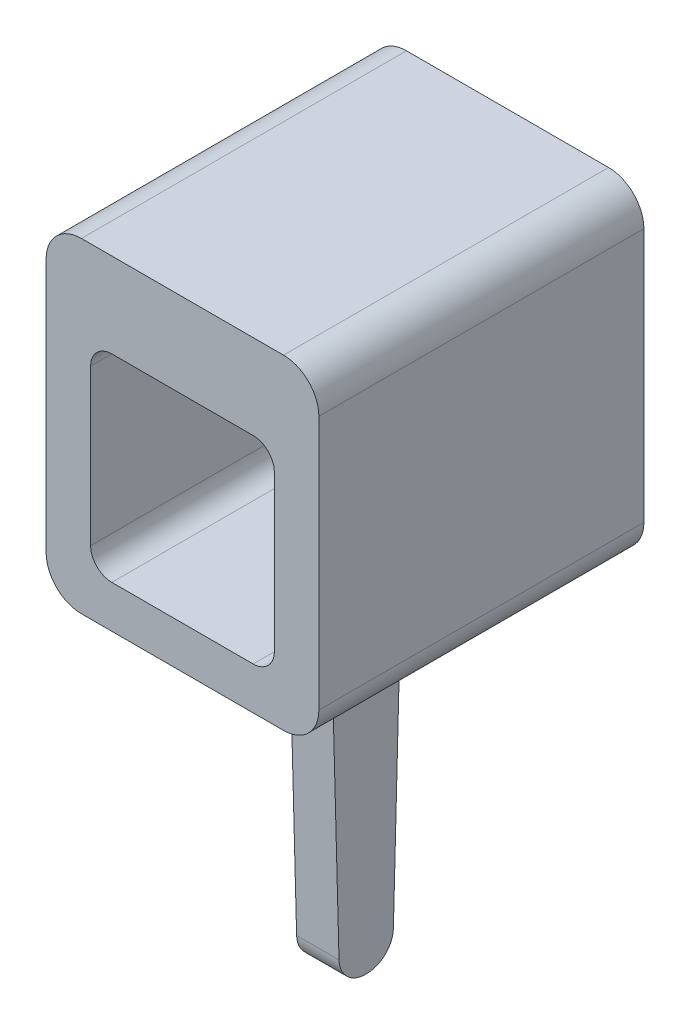
ISO-10303-21;
HEADER;
FILE_DESCRIPTION(('STEP AP214'),'2;1');
FILE_NAME('part.step','',(''),(''),'','','');
FILE_SCHEMA(('AUTOMOTIVE_DESIGN { 1 0 10303 214 1 1 1 1 }'));
ENDSEC;
DATA;
#1=APPLICATION_CONTEXT('core data for automotive mechanical design processes');
#2=APPLICATION_PROTOCOL_DEFINITION('international standard','automotive_design',2000,#1);
#3=PRODUCT_CONTEXT('',#1,'mechanical');
#4=PRODUCT('Part','Part','',(#3));
#5=PRODUCT_RELATED_PRODUCT_CATEGORY('part','',(#4));
#6=PRODUCT_DEFINITION_FORMATION('','',#4);
#7=PRODUCT_DEFINITION_CONTEXT('part definition',#1,'design');
#8=PRODUCT_DEFINITION('design','',#6,#7);
#9=PRODUCT_DEFINITION_SHAPE('','',#8);
#10=(LENGTH_UNIT() NAMED_UNIT(*) SI_UNIT(.MILLI.,.METRE.));
#11=(NAMED_UNIT(*) PLANE_ANGLE_UNIT() SI_UNIT($,.RADIAN.));
#12=(NAMED_UNIT(*) SI_UNIT($,.STERADIAN.) SOLID_ANGLE_UNIT());
#13=UNCERTAINTY_MEASURE_WITH_UNIT(LENGTH_MEASURE(1.E-05),#10,'distance_accuracy_value','');
#14=(GEOMETRIC_REPRESENTATION_CONTEXT(3) GLOBAL_UNCERTAINTY_ASSIGNED_CONTEXT((#13)) GLOBAL_UNIT_ASSIGNED_CONTEXT((#10,
#11,#12)) REPRESENTATION_CONTEXT('',''));
#15=CARTESIAN_POINT('',(0.,0.,0.));
#16=DIRECTION('',(0.,0.,1.));
#17=DIRECTION('',(1.,0.,0.));
#18=AXIS2_PLACEMENT_3D('',#15,#16,#17);
#19=CARTESIAN_POINT('',(0.,0.,0.));
#20=DIRECTION('',(0.,1.,0.));
#21=DIRECTION('',(0.,0.,1.));
#22=AXIS2_PLACEMENT_3D('',#19,#20,#21);
#23=PLANE('',#22);
#24=DIRECTION('',(-1.,0.,0.));
#25=VECTOR('',#24,1.);
#26=CARTESIAN_POINT('',(-1.93,0.,-2.3));
#27=LINE('',#26,#25);
#28=CARTESIAN_POINT('',(1.43,0.,-2.3));
#29=VERTEX_POINT('',#28);
#30=CARTESIAN_POINT('',(-1.43,0.,-2.3));
#31=VERTEX_POINT('',#30);
#32=EDGE_CURVE('E241',#29,#31,#27,.T.);
#33=ORIENTED_EDGE('',*,*,#32,.F.);
#34=DIRECTION('',(0.,0.,-1.));
#35=VECTOR('',#34,1.);
#36=CARTESIAN_POINT('',(1.43,0.,0.));
#37=LINE('',#36,#35);
#38=CARTESIAN_POINT('',(1.43,0.,2.3));
#39=VERTEX_POINT('',#38);
#40=EDGE_CURVE('E275',#29,#39,#37,.F.);
#41=ORIENTED_EDGE('',*,*,#40,.T.);
#42=DIRECTION('',(1.,0.,0.));
#43=VECTOR('',#42,1.);
#44=CARTESIAN_POINT('',(-1.93,0.,2.3));
#45=LINE('',#44,#43);
#46=CARTESIAN_POINT('',(-1.43,0.,2.3));
#47=VERTEX_POINT('',#46);
#48=EDGE_CURVE('E225',#47,#39,#45,.T.);
#49=ORIENTED_EDGE('',*,*,#48,.F.);
#50=DIRECTION('',(0.,0.,1.));
#51=VECTOR('',#50,1.);
#52=CARTESIAN_POINT('',(-1.43,0.,0.));
#53=LINE('',#52,#51);
#54=EDGE_CURVE('E273',#47,#31,#53,.F.);
#55=ORIENTED_EDGE('',*,*,#54,.T.);
#56=EDGE_LOOP('',(#33,#41,#49,#55));
#57=FACE_BOUND('',#56,.T.);
#58=DIRECTION('',(0.,0.,-1.));
#59=VECTOR('',#58,1.);
#60=CARTESIAN_POINT('',(-0.3,0.,0.5));
#61=LINE('',#60,#59);
#62=CARTESIAN_POINT('',(-0.3,0.,0.5));
#63=VERTEX_POINT('',#62);
#64=CARTESIAN_POINT('',(-0.3,0.,-0.5));
#65=VERTEX_POINT('',#64);
#66=EDGE_CURVE('E185',#63,#65,#61,.T.);
#67=ORIENTED_EDGE('',*,*,#66,.F.);
#68=DIRECTION('',(-1.,0.,0.));
#69=VECTOR('',#68,1.);
#70=CARTESIAN_POINT('',(-0.3,0.,0.5));
#71=LINE('',#70,#69);
#72=CARTESIAN_POINT('',(0.3,0.,0.5));
#73=VERTEX_POINT('',#72);
#74=EDGE_CURVE('E194',#73,#63,#71,.T.);
#75=ORIENTED_EDGE('',*,*,#74,.F.);
#76=DIRECTION('',(0.,0.,1.));
#77=VECTOR('',#76,1.);
#78=CARTESIAN_POINT('',(0.3,0.,0.5));
#79=LINE('',#78,#77);
#80=CARTESIAN_POINT('',(0.3,0.,-0.5));
#81=VERTEX_POINT('',#80);
#82=EDGE_CURVE('E204',#81,#73,#79,.T.);
#83=ORIENTED_EDGE('',*,*,#82,.F.);
#84=DIRECTION('',(1.,0.,0.));
#85=VECTOR('',#84,1.);
#86=CARTESIAN_POINT('',(-0.3,0.,-0.5));
#87=LINE('',#86,#85);
#88=EDGE_CURVE('E197',#65,#81,#87,.T.);
#89=ORIENTED_EDGE('',*,*,#88,.F.);
#90=EDGE_LOOP('',(#67,#75,#83,#89));
#91=FACE_BOUND('',#90,.T.);
#92=ADVANCED_FACE('F34',(#57,#91),#23,.F.);
#93=CARTESIAN_POINT('',(-1.93,4.6,-2.3));
#94=DIRECTION('',(1.,0.,0.));
#95=DIRECTION('',(0.,0.,-1.));
#96=AXIS2_PLACEMENT_3D('',#93,#94,#95);
#97=PLANE('',#96);
#98=DIRECTION('',(0.,-1.,0.));
#99=VECTOR('',#98,1.);
#100=CARTESIAN_POINT('',(-1.93,4.6,-2.3));
#101=LINE('',#100,#99);
#102=CARTESIAN_POINT('',(-1.93,4.1,-2.3));
#103=VERTEX_POINT('',#102);
#104=CARTESIAN_POINT('',(-1.93,0.5,-2.3));
#105=VERTEX_POINT('',#104);
#106=EDGE_CURVE('E244',#103,#105,#101,.T.);
#107=ORIENTED_EDGE('',*,*,#106,.T.);
#108=DIRECTION('',(0.,0.,1.));
#109=VECTOR('',#108,1.);
#110=CARTESIAN_POINT('',(-1.93,0.5,-2.3));
#111=LINE('',#110,#109);
#112=CARTESIAN_POINT('',(-1.93,0.5,2.3));
#113=VERTEX_POINT('',#112);
#114=EDGE_CURVE('E287',#105,#113,#111,.T.);
#115=ORIENTED_EDGE('',*,*,#114,.T.);
#116=DIRECTION('',(0.,-1.,0.));
#117=VECTOR('',#116,1.);
#118=CARTESIAN_POINT('',(-1.93,4.6,2.3));
#119=LINE('',#118,#117);
#120=CARTESIAN_POINT('',(-1.93,4.1,2.3));
#121=VERTEX_POINT('',#120);
#122=EDGE_CURVE('E257',#121,#113,#119,.T.);
#123=ORIENTED_EDGE('',*,*,#122,.F.);
#124=DIRECTION('',(0.,0.,1.));
#125=VECTOR('',#124,1.);
#126=CARTESIAN_POINT('',(-1.93,4.1,-2.3));
#127=LINE('',#126,#125);
#128=EDGE_CURVE('E285',#121,#103,#127,.F.);
#129=ORIENTED_EDGE('',*,*,#128,.T.);
#130=EDGE_LOOP('',(#107,#115,#123,#129));
#131=FACE_BOUND('',#130,.T.);
#132=ADVANCED_FACE('F366',(#131),#97,.F.);
#133=CARTESIAN_POINT('',(-1.93,4.6,2.3));
#134=DIRECTION('',(0.,0.,-1.));
#135=DIRECTION('',(-1.,0.,0.));
#136=AXIS2_PLACEMENT_3D('',#133,#134,#135);
#137=PLANE('',#136);
#138=DIRECTION('',(1.,0.,0.));
#139=VECTOR('',#138,1.);
#140=CARTESIAN_POINT('',(-1.3,0.6,2.3));
#141=LINE('',#140,#139);
#142=CARTESIAN_POINT('',(-1.,0.6,2.3));
#143=VERTEX_POINT('',#142);
#144=CARTESIAN_POINT('',(1.,0.6,2.3));
#145=VERTEX_POINT('',#144);
#146=EDGE_CURVE('E229',#143,#145,#141,.T.);
#147=ORIENTED_EDGE('',*,*,#146,.F.);
#148=CARTESIAN_POINT('',(-1.,0.9,2.3));
#149=DIRECTION('',(0.,0.,-1.));
#150=DIRECTION('',(-1.,0.,0.));
#151=AXIS2_PLACEMENT_3D('',#148,#149,#150);
#152=CIRCLE('',#151,0.3);
#153=CARTESIAN_POINT('',(-1.3,0.9,2.3));
#154=VERTEX_POINT('',#153);
#155=EDGE_CURVE('E324',#143,#154,#152,.T.);
#156=ORIENTED_EDGE('',*,*,#155,.T.);
#157=DIRECTION('',(0.,-1.,0.));
#158=VECTOR('',#157,1.);
#159=CARTESIAN_POINT('',(-1.3,3.4,2.3));
#160=LINE('',#159,#158);
#161=CARTESIAN_POINT('',(-1.3,3.1,2.3));
#162=VERTEX_POINT('',#161);
#163=EDGE_CURVE('E226',#162,#154,#160,.T.);
#164=ORIENTED_EDGE('',*,*,#163,.F.);
#165=CARTESIAN_POINT('',(-1.,3.1,2.3));
#166=DIRECTION('',(0.,0.,-1.));
#167=DIRECTION('',(-1.,0.,0.));
#168=AXIS2_PLACEMENT_3D('',#165,#166,#167);
#169=CIRCLE('',#168,0.3);
#170=CARTESIAN_POINT('',(-1.,3.4,2.3));
#171=VERTEX_POINT('',#170);
#172=EDGE_CURVE('E320',#162,#171,#169,.T.);
#173=ORIENTED_EDGE('',*,*,#172,.T.);
#174=DIRECTION('',(-1.,0.,0.));
#175=VECTOR('',#174,1.);
#176=CARTESIAN_POINT('',(-1.3,3.4,2.3));
#177=LINE('',#176,#175);
#178=CARTESIAN_POINT('',(1.,3.4,2.3));
#179=VERTEX_POINT('',#178);
#180=EDGE_CURVE('E216',#179,#171,#177,.T.);
#181=ORIENTED_EDGE('',*,*,#180,.F.);
#182=CARTESIAN_POINT('',(1.,3.1,2.3));
#183=DIRECTION('',(0.,0.,-1.));
#184=DIRECTION('',(-1.,0.,0.));
#185=AXIS2_PLACEMENT_3D('',#182,#183,#184);
#186=CIRCLE('',#185,0.3);
#187=CARTESIAN_POINT('',(1.3,3.1,2.3));
#188=VERTEX_POINT('',#187);
#189=EDGE_CURVE('E316',#179,#188,#186,.T.);
#190=ORIENTED_EDGE('',*,*,#189,.T.);
#191=DIRECTION('',(0.,1.,0.));
#192=VECTOR('',#191,1.);
#193=CARTESIAN_POINT('',(1.3,3.4,2.3));
#194=LINE('',#193,#192);
#195=CARTESIAN_POINT('',(1.3,0.9,2.3));
#196=VERTEX_POINT('',#195);
#197=EDGE_CURVE('E232',#196,#188,#194,.T.);
#198=ORIENTED_EDGE('',*,*,#197,.F.);
#199=CARTESIAN_POINT('',(1.,0.9,2.3));
#200=DIRECTION('',(0.,0.,-1.));
#201=DIRECTION('',(-1.,0.,0.));
#202=AXIS2_PLACEMENT_3D('',#199,#200,#201);
#203=CIRCLE('',#202,0.3);
#204=EDGE_CURVE('E328',#196,#145,#203,.T.);
#205=ORIENTED_EDGE('',*,*,#204,.T.);
#206=EDGE_LOOP('',(#147,#156,#164,#173,#181,#190,#198,#205));
#207=FACE_BOUND('',#206,.T.);
#208=ORIENTED_EDGE('',*,*,#48,.T.);
#209=CARTESIAN_POINT('',(1.43,0.5,2.3));
#210=DIRECTION('',(0.,0.,-1.));
#211=DIRECTION('',(-1.,0.,0.));
#212=AXIS2_PLACEMENT_3D('',#209,#210,#211);
#213=CIRCLE('',#212,0.5);
#214=CARTESIAN_POINT('',(1.93,0.5,2.3));
#215=VERTEX_POINT('',#214);
#216=EDGE_CURVE('E283',#39,#215,#213,.F.);
#217=ORIENTED_EDGE('',*,*,#216,.T.);
#218=DIRECTION('',(0.,-1.,0.));
#219=VECTOR('',#218,1.);
#220=CARTESIAN_POINT('',(1.93,4.6,2.3));
#221=LINE('',#220,#219);
#222=CARTESIAN_POINT('',(1.93,4.1,2.3));
#223=VERTEX_POINT('',#222);
#224=EDGE_CURVE('E254',#223,#215,#221,.T.);
#225=ORIENTED_EDGE('',*,*,#224,.F.);
#226=CARTESIAN_POINT('',(1.43,4.1,2.3));
#227=DIRECTION('',(0.,0.,-1.));
#228=DIRECTION('',(-1.,0.,0.));
#229=AXIS2_PLACEMENT_3D('',#226,#227,#228);
#230=CIRCLE('',#229,0.5);
#231=CARTESIAN_POINT('',(1.43,4.6,2.3));
#232=VERTEX_POINT('',#231);
#233=EDGE_CURVE('E279',#223,#232,#230,.F.);
#234=ORIENTED_EDGE('',*,*,#233,.T.);
#235=DIRECTION('',(1.,0.,0.));
#236=VECTOR('',#235,1.);
#237=CARTESIAN_POINT('',(-1.93,4.6,2.3));
#238=LINE('',#237,#236);
#239=CARTESIAN_POINT('',(-1.43,4.6,2.3));
#240=VERTEX_POINT('',#239);
#241=EDGE_CURVE('E237',#240,#232,#238,.T.);
#242=ORIENTED_EDGE('',*,*,#241,.F.);
#243=CARTESIAN_POINT('',(-1.43,4.1,2.3));
#244=DIRECTION('',(0.,0.,-1.));
#245=DIRECTION('',(-1.,0.,0.));
#246=AXIS2_PLACEMENT_3D('',#243,#244,#245);
#247=CIRCLE('',#246,0.5);
#248=EDGE_CURVE('E277',#240,#121,#247,.F.);
#249=ORIENTED_EDGE('',*,*,#248,.T.);
#250=ORIENTED_EDGE('',*,*,#122,.T.);
#251=CARTESIAN_POINT('',(-1.43,0.5,2.3));
#252=DIRECTION('',(0.,0.,-1.));
#253=DIRECTION('',(-1.,0.,0.));
#254=AXIS2_PLACEMENT_3D('',#251,#252,#253);
#255=CIRCLE('',#254,0.5);
#256=EDGE_CURVE('E281',#113,#47,#255,.F.);
#257=ORIENTED_EDGE('',*,*,#256,.T.);
#258=EDGE_LOOP('',(#208,#217,#225,#234,#242,#249,#250,#257));
#259=FACE_BOUND('',#258,.T.);
#260=ADVANCED_FACE('F372',(#207,#259),#137,.F.);
#261=CARTESIAN_POINT('',(1.93,4.6,-2.3));
#262=DIRECTION('',(-1.,0.,0.));
#263=DIRECTION('',(0.,0.,1.));
#264=AXIS2_PLACEMENT_3D('',#261,#262,#263);
#265=PLANE('',#264);
#266=ORIENTED_EDGE('',*,*,#224,.T.);
#267=DIRECTION('',(0.,0.,-1.));
#268=VECTOR('',#267,1.);
#269=CARTESIAN_POINT('',(1.93,0.5,-2.3));
#270=LINE('',#269,#268);
#271=CARTESIAN_POINT('',(1.93,0.5,-2.3));
#272=VERTEX_POINT('',#271);
#273=EDGE_CURVE('E262',#215,#272,#270,.T.);
#274=ORIENTED_EDGE('',*,*,#273,.T.);
#275=DIRECTION('',(0.,-1.,0.));
#276=VECTOR('',#275,1.);
#277=CARTESIAN_POINT('',(1.93,4.6,-2.3));
#278=LINE('',#277,#276);
#279=CARTESIAN_POINT('',(1.93,4.1,-2.3));
#280=VERTEX_POINT('',#279);
#281=EDGE_CURVE('E251',#280,#272,#278,.T.);
#282=ORIENTED_EDGE('',*,*,#281,.F.);
#283=DIRECTION('',(0.,0.,-1.));
#284=VECTOR('',#283,1.);
#285=CARTESIAN_POINT('',(1.93,4.1,2.3));
#286=LINE('',#285,#284);
#287=EDGE_CURVE('E260',#280,#223,#286,.F.);
#288=ORIENTED_EDGE('',*,*,#287,.T.);
#289=EDGE_LOOP('',(#266,#274,#282,#288));
#290=FACE_BOUND('',#289,.T.);
#291=ADVANCED_FACE('F383',(#290),#265,.F.);
#292=CARTESIAN_POINT('',(-1.93,4.6,-2.3));
#293=DIRECTION('',(0.,0.,1.));
#294=DIRECTION('',(1.,0.,0.));
#295=AXIS2_PLACEMENT_3D('',#292,#293,#294);
#296=PLANE('',#295);
#297=DIRECTION('',(0.,1.,0.));
#298=VECTOR('',#297,1.);
#299=CARTESIAN_POINT('',(1.3,3.4,-2.3));
#300=LINE('',#299,#298);
#301=CARTESIAN_POINT('',(1.3,0.9,-2.3));
#302=VERTEX_POINT('',#301);
#303=CARTESIAN_POINT('',(1.3,3.1,-2.3));
#304=VERTEX_POINT('',#303);
#305=EDGE_CURVE('E219',#302,#304,#300,.T.);
#306=ORIENTED_EDGE('',*,*,#305,.T.);
#307=CARTESIAN_POINT('',(1.,3.1,-2.3));
#308=DIRECTION('',(0.,0.,1.));
#309=DIRECTION('',(1.,0.,0.));
#310=AXIS2_PLACEMENT_3D('',#307,#308,#309);
#311=CIRCLE('',#310,0.3);
#312=CARTESIAN_POINT('',(1.,3.4,-2.3));
#313=VERTEX_POINT('',#312);
#314=EDGE_CURVE('E318',#304,#313,#311,.T.);
#315=ORIENTED_EDGE('',*,*,#314,.T.);
#316=DIRECTION('',(-1.,0.,0.));
#317=VECTOR('',#316,1.);
#318=CARTESIAN_POINT('',(-1.3,3.4,-2.3));
#319=LINE('',#318,#317);
#320=CARTESIAN_POINT('',(-1.,3.4,-2.3));
#321=VERTEX_POINT('',#320);
#322=EDGE_CURVE('E222',#313,#321,#319,.T.);
#323=ORIENTED_EDGE('',*,*,#322,.T.);
#324=CARTESIAN_POINT('',(-1.,3.1,-2.3));
#325=DIRECTION('',(0.,0.,1.));
#326=DIRECTION('',(1.,0.,0.));
#327=AXIS2_PLACEMENT_3D('',#324,#325,#326);
#328=CIRCLE('',#327,0.3);
#329=CARTESIAN_POINT('',(-1.3,3.1,-2.3));
#330=VERTEX_POINT('',#329);
#331=EDGE_CURVE('E322',#321,#330,#328,.T.);
#332=ORIENTED_EDGE('',*,*,#331,.T.);
#333=DIRECTION('',(0.,-1.,0.));
#334=VECTOR('',#333,1.);
#335=CARTESIAN_POINT('',(-1.3,3.4,-2.3));
#336=LINE('',#335,#334);
#337=CARTESIAN_POINT('',(-1.3,0.9,-2.3));
#338=VERTEX_POINT('',#337);
#339=EDGE_CURVE('E212',#330,#338,#336,.T.);
#340=ORIENTED_EDGE('',*,*,#339,.T.);
#341=CARTESIAN_POINT('',(-1.,0.9,-2.3));
#342=DIRECTION('',(0.,0.,1.));
#343=DIRECTION('',(1.,0.,0.));
#344=AXIS2_PLACEMENT_3D('',#341,#342,#343);
#345=CIRCLE('',#344,0.3);
#346=CARTESIAN_POINT('',(-1.,0.6,-2.3));
#347=VERTEX_POINT('',#346);
#348=EDGE_CURVE('E326',#338,#347,#345,.T.);
#349=ORIENTED_EDGE('',*,*,#348,.T.);
#350=DIRECTION('',(1.,0.,0.));
#351=VECTOR('',#350,1.);
#352=CARTESIAN_POINT('',(-1.3,0.6,-2.3));
#353=LINE('',#352,#351);
#354=CARTESIAN_POINT('',(1.,0.6,-2.3));
#355=VERTEX_POINT('',#354);
#356=EDGE_CURVE('E215',#347,#355,#353,.T.);
#357=ORIENTED_EDGE('',*,*,#356,.T.);
#358=CARTESIAN_POINT('',(1.,0.9,-2.3));
#359=DIRECTION('',(0.,0.,1.));
#360=DIRECTION('',(1.,0.,0.));
#361=AXIS2_PLACEMENT_3D('',#358,#359,#360);
#362=CIRCLE('',#361,0.3);
#363=EDGE_CURVE('E330',#355,#302,#362,.T.);
#364=ORIENTED_EDGE('',*,*,#363,.T.);
#365=EDGE_LOOP('',(#306,#315,#323,#332,#340,#349,#357,#364));
#366=FACE_BOUND('',#365,.T.);
#367=ORIENTED_EDGE('',*,*,#281,.T.);
#368=CARTESIAN_POINT('',(1.43,0.5,-2.3));
#369=DIRECTION('',(0.,0.,1.));
#370=DIRECTION('',(1.,0.,0.));
#371=AXIS2_PLACEMENT_3D('',#368,#369,#370);
#372=CIRCLE('',#371,0.5);
#373=EDGE_CURVE('E271',#272,#29,#372,.F.);
#374=ORIENTED_EDGE('',*,*,#373,.T.);
#375=ORIENTED_EDGE('',*,*,#32,.T.);
#376=CARTESIAN_POINT('',(-1.43,0.5,-2.3));
#377=DIRECTION('',(0.,0.,1.));
#378=DIRECTION('',(1.,0.,0.));
#379=AXIS2_PLACEMENT_3D('',#376,#377,#378);
#380=CIRCLE('',#379,0.5);
#381=EDGE_CURVE('E269',#31,#105,#380,.F.);
#382=ORIENTED_EDGE('',*,*,#381,.T.);
#383=ORIENTED_EDGE('',*,*,#106,.F.);
#384=CARTESIAN_POINT('',(-1.43,4.1,-2.3));
#385=DIRECTION('',(0.,0.,1.));
#386=DIRECTION('',(1.,0.,0.));
#387=AXIS2_PLACEMENT_3D('',#384,#385,#386);
#388=CIRCLE('',#387,0.5);
#389=CARTESIAN_POINT('',(-1.43,4.6,-2.3));
#390=VERTEX_POINT('',#389);
#391=EDGE_CURVE('E265',#103,#390,#388,.F.);
#392=ORIENTED_EDGE('',*,*,#391,.T.);
#393=DIRECTION('',(-1.,0.,0.));
#394=VECTOR('',#393,1.);
#395=CARTESIAN_POINT('',(-1.93,4.6,-2.3));
#396=LINE('',#395,#394);
#397=CARTESIAN_POINT('',(1.43,4.6,-2.3));
#398=VERTEX_POINT('',#397);
#399=EDGE_CURVE('E240',#398,#390,#396,.T.);
#400=ORIENTED_EDGE('',*,*,#399,.F.);
#401=CARTESIAN_POINT('',(1.43,4.1,-2.3));
#402=DIRECTION('',(0.,0.,1.));
#403=DIRECTION('',(1.,0.,0.));
#404=AXIS2_PLACEMENT_3D('',#401,#402,#403);
#405=CIRCLE('',#404,0.5);
#406=EDGE_CURVE('E267',#398,#280,#405,.F.);
#407=ORIENTED_EDGE('',*,*,#406,.T.);
#408=EDGE_LOOP('',(#367,#374,#375,#382,#383,#392,#400,#407));
#409=FACE_BOUND('',#408,.T.);
#410=ADVANCED_FACE('F380',(#366,#409),#296,.F.);
#411=CARTESIAN_POINT('',(0.,4.6,0.));
#412=DIRECTION('',(0.,1.,0.));
#413=DIRECTION('',(0.,0.,1.));
#414=AXIS2_PLACEMENT_3D('',#411,#412,#413);
#415=PLANE('',#414);
#416=ORIENTED_EDGE('',*,*,#241,.T.);
#417=DIRECTION('',(0.,0.,-1.));
#418=VECTOR('',#417,1.);
#419=CARTESIAN_POINT('',(1.43,4.6,-2.3));
#420=LINE('',#419,#418);
#421=EDGE_CURVE('E293',#232,#398,#420,.T.);
#422=ORIENTED_EDGE('',*,*,#421,.T.);
#423=ORIENTED_EDGE('',*,*,#399,.T.);
#424=DIRECTION('',(0.,0.,1.));
#425=VECTOR('',#424,1.);
#426=CARTESIAN_POINT('',(-1.43,4.6,2.3));
#427=LINE('',#426,#425);
#428=EDGE_CURVE('E290',#390,#240,#427,.T.);
#429=ORIENTED_EDGE('',*,*,#428,.T.);
#430=EDGE_LOOP('',(#416,#422,#423,#429));
#431=FACE_BOUND('',#430,.T.);
#432=ADVANCED_FACE('F378',(#431),#415,.T.);
#433=CARTESIAN_POINT('',(-1.3,3.4,-2.3));
#434=DIRECTION('',(-1.,0.,0.));
#435=DIRECTION('',(0.,-1.,0.));
#436=AXIS2_PLACEMENT_3D('',#433,#434,#435);
#437=PLANE('',#436);
#438=ORIENTED_EDGE('',*,*,#339,.F.);
#439=DIRECTION('',(0.,0.,1.));
#440=VECTOR('',#439,1.);
#441=CARTESIAN_POINT('',(-1.3,3.1,2.3));
#442=LINE('',#441,#440);
#443=EDGE_CURVE('E308',#330,#162,#442,.T.);
#444=ORIENTED_EDGE('',*,*,#443,.T.);
#445=ORIENTED_EDGE('',*,*,#163,.T.);
#446=DIRECTION('',(0.,0.,1.));
#447=VECTOR('',#446,1.);
#448=CARTESIAN_POINT('',(-1.3,0.9,-2.3));
#449=LINE('',#448,#447);
#450=EDGE_CURVE('E306',#154,#338,#449,.F.);
#451=ORIENTED_EDGE('',*,*,#450,.T.);
#452=EDGE_LOOP('',(#438,#444,#445,#451));
#453=FACE_BOUND('',#452,.T.);
#454=ADVANCED_FACE('F540',(#453),#437,.F.);
#455=CARTESIAN_POINT('',(-1.3,3.4,-2.3));
#456=DIRECTION('',(0.,1.,0.));
#457=DIRECTION('',(-1.,0.,0.));
#458=AXIS2_PLACEMENT_3D('',#455,#456,#457);
#459=PLANE('',#458);
#460=ORIENTED_EDGE('',*,*,#322,.F.);
#461=DIRECTION('',(0.,0.,1.));
#462=VECTOR('',#461,1.);
#463=CARTESIAN_POINT('',(1.,3.4,2.3));
#464=LINE('',#463,#462);
#465=EDGE_CURVE('E298',#313,#179,#464,.T.);
#466=ORIENTED_EDGE('',*,*,#465,.T.);
#467=ORIENTED_EDGE('',*,*,#180,.T.);
#468=DIRECTION('',(0.,0.,1.));
#469=VECTOR('',#468,1.);
#470=CARTESIAN_POINT('',(-1.,3.4,-2.3));
#471=LINE('',#470,#469);
#472=EDGE_CURVE('E296',#171,#321,#471,.F.);
#473=ORIENTED_EDGE('',*,*,#472,.T.);
#474=EDGE_LOOP('',(#460,#466,#467,#473));
#475=FACE_BOUND('',#474,.T.);
#476=ADVANCED_FACE('F531',(#475),#459,.F.);
#477=CARTESIAN_POINT('',(1.3,3.4,-2.3));
#478=DIRECTION('',(1.,0.,0.));
#479=DIRECTION('',(0.,1.,0.));
#480=AXIS2_PLACEMENT_3D('',#477,#478,#479);
#481=PLANE('',#480);
#482=ORIENTED_EDGE('',*,*,#197,.T.);
#483=DIRECTION('',(0.,0.,1.));
#484=VECTOR('',#483,1.);
#485=CARTESIAN_POINT('',(1.3,3.1,-2.3));
#486=LINE('',#485,#484);
#487=EDGE_CURVE('E304',#188,#304,#486,.F.);
#488=ORIENTED_EDGE('',*,*,#487,.T.);
#489=ORIENTED_EDGE('',*,*,#305,.F.);
#490=DIRECTION('',(0.,0.,1.));
#491=VECTOR('',#490,1.);
#492=CARTESIAN_POINT('',(1.3,0.9,2.3));
#493=LINE('',#492,#491);
#494=EDGE_CURVE('E301',#302,#196,#493,.T.);
#495=ORIENTED_EDGE('',*,*,#494,.T.);
#496=EDGE_LOOP('',(#482,#488,#489,#495));
#497=FACE_BOUND('',#496,.T.);
#498=ADVANCED_FACE('F522',(#497),#481,.F.);
#499=CARTESIAN_POINT('',(-1.3,0.6,-2.3));
#500=DIRECTION('',(0.,-1.,0.));
#501=DIRECTION('',(0.,0.,-1.));
#502=AXIS2_PLACEMENT_3D('',#499,#500,#501);
#503=PLANE('',#502);
#504=ORIENTED_EDGE('',*,*,#356,.F.);
#505=DIRECTION('',(0.,0.,1.));
#506=VECTOR('',#505,1.);
#507=CARTESIAN_POINT('',(-1.,0.6,2.3));
#508=LINE('',#507,#506);
#509=EDGE_CURVE('E313',#347,#143,#508,.T.);
#510=ORIENTED_EDGE('',*,*,#509,.T.);
#511=ORIENTED_EDGE('',*,*,#146,.T.);
#512=DIRECTION('',(0.,0.,1.));
#513=VECTOR('',#512,1.);
#514=CARTESIAN_POINT('',(1.,0.6,-2.3));
#515=LINE('',#514,#513);
#516=EDGE_CURVE('E311',#145,#355,#515,.F.);
#517=ORIENTED_EDGE('',*,*,#516,.T.);
#518=EDGE_LOOP('',(#504,#510,#511,#517));
#519=FACE_BOUND('',#518,.T.);
#520=ADVANCED_FACE('F395',(#519),#503,.F.);
#521=CARTESIAN_POINT('',(1.43,0.5,-2.3));
#522=DIRECTION('',(0.,0.,-1.));
#523=DIRECTION('',(-1.,0.,0.));
#524=AXIS2_PLACEMENT_3D('',#521,#522,#523);
#525=CYLINDRICAL_SURFACE('',#524,0.5);
#526=ORIENTED_EDGE('',*,*,#216,.F.);
#527=ORIENTED_EDGE('',*,*,#40,.F.);
#528=ORIENTED_EDGE('',*,*,#373,.F.);
#529=ORIENTED_EDGE('',*,*,#273,.F.);
#530=EDGE_LOOP('',(#526,#527,#528,#529));
#531=FACE_BOUND('',#530,.T.);
#532=ADVANCED_FACE('F391',(#531),#525,.T.);
#533=CARTESIAN_POINT('',(-1.43,0.5,-2.3));
#534=DIRECTION('',(0.,0.,1.));
#535=DIRECTION('',(1.,0.,0.));
#536=AXIS2_PLACEMENT_3D('',#533,#534,#535);
#537=CYLINDRICAL_SURFACE('',#536,0.5);
#538=ORIENTED_EDGE('',*,*,#381,.F.);
#539=ORIENTED_EDGE('',*,*,#54,.F.);
#540=ORIENTED_EDGE('',*,*,#256,.F.);
#541=ORIENTED_EDGE('',*,*,#114,.F.);
#542=EDGE_LOOP('',(#538,#539,#540,#541));
#543=FACE_BOUND('',#542,.T.);
#544=ADVANCED_FACE('F394',(#543),#537,.T.);
#545=CARTESIAN_POINT('',(1.43,4.1,0.));
#546=DIRECTION('',(0.,0.,1.));
#547=DIRECTION('',(1.,0.,0.));
#548=AXIS2_PLACEMENT_3D('',#545,#546,#547);
#549=CYLINDRICAL_SURFACE('',#548,0.5);
#550=ORIENTED_EDGE('',*,*,#233,.F.);
#551=ORIENTED_EDGE('',*,*,#287,.F.);
#552=ORIENTED_EDGE('',*,*,#406,.F.);
#553=ORIENTED_EDGE('',*,*,#421,.F.);
#554=EDGE_LOOP('',(#550,#551,#552,#553));
#555=FACE_BOUND('',#554,.T.);
#556=ADVANCED_FACE('F399',(#555),#549,.T.);
#557=CARTESIAN_POINT('',(-1.43,4.1,0.));
#558=DIRECTION('',(0.,0.,-1.));
#559=DIRECTION('',(-1.,0.,0.));
#560=AXIS2_PLACEMENT_3D('',#557,#558,#559);
#561=CYLINDRICAL_SURFACE('',#560,0.5);
#562=ORIENTED_EDGE('',*,*,#391,.F.);
#563=ORIENTED_EDGE('',*,*,#128,.F.);
#564=ORIENTED_EDGE('',*,*,#248,.F.);
#565=ORIENTED_EDGE('',*,*,#428,.F.);
#566=EDGE_LOOP('',(#562,#563,#564,#565));
#567=FACE_BOUND('',#566,.T.);
#568=ADVANCED_FACE('F403',(#567),#561,.T.);
#569=CARTESIAN_POINT('',(1.,3.1,-2.3));
#570=DIRECTION('',(0.,0.,-1.));
#571=DIRECTION('',(-1.,0.,0.));
#572=AXIS2_PLACEMENT_3D('',#569,#570,#571);
#573=CYLINDRICAL_SURFACE('',#572,0.3);
#574=ORIENTED_EDGE('',*,*,#314,.F.);
#575=ORIENTED_EDGE('',*,*,#487,.F.);
#576=ORIENTED_EDGE('',*,*,#189,.F.);
#577=ORIENTED_EDGE('',*,*,#465,.F.);
#578=EDGE_LOOP('',(#574,#575,#576,#577));
#579=FACE_BOUND('',#578,.T.);
#580=ADVANCED_FACE('F407',(#579),#573,.F.);
#581=CARTESIAN_POINT('',(-1.,3.1,-2.3));
#582=DIRECTION('',(0.,0.,-1.));
#583=DIRECTION('',(-1.,0.,0.));
#584=AXIS2_PLACEMENT_3D('',#581,#582,#583);
#585=CYLINDRICAL_SURFACE('',#584,0.3);
#586=ORIENTED_EDGE('',*,*,#331,.F.);
#587=ORIENTED_EDGE('',*,*,#472,.F.);
#588=ORIENTED_EDGE('',*,*,#172,.F.);
#589=ORIENTED_EDGE('',*,*,#443,.F.);
#590=EDGE_LOOP('',(#586,#587,#588,#589));
#591=FACE_BOUND('',#590,.T.);
#592=ADVANCED_FACE('F411',(#591),#585,.F.);
#593=CARTESIAN_POINT('',(-1.,0.9,-2.3));
#594=DIRECTION('',(0.,0.,-1.));
#595=DIRECTION('',(-1.,0.,0.));
#596=AXIS2_PLACEMENT_3D('',#593,#594,#595);
#597=CYLINDRICAL_SURFACE('',#596,0.3);
#598=ORIENTED_EDGE('',*,*,#348,.F.);
#599=ORIENTED_EDGE('',*,*,#450,.F.);
#600=ORIENTED_EDGE('',*,*,#155,.F.);
#601=ORIENTED_EDGE('',*,*,#509,.F.);
#602=EDGE_LOOP('',(#598,#599,#600,#601));
#603=FACE_BOUND('',#602,.T.);
#604=ADVANCED_FACE('F415',(#603),#597,.F.);
#605=CARTESIAN_POINT('',(1.,0.9,-2.3));
#606=DIRECTION('',(0.,0.,-1.));
#607=DIRECTION('',(-1.,0.,0.));
#608=AXIS2_PLACEMENT_3D('',#605,#606,#607);
#609=CYLINDRICAL_SURFACE('',#608,0.3);
#610=ORIENTED_EDGE('',*,*,#363,.F.);
#611=ORIENTED_EDGE('',*,*,#516,.F.);
#612=ORIENTED_EDGE('',*,*,#204,.F.);
#613=ORIENTED_EDGE('',*,*,#494,.F.);
#614=EDGE_LOOP('',(#610,#611,#612,#613));
#615=FACE_BOUND('',#614,.T.);
#616=ADVANCED_FACE('F419',(#615),#609,.F.);
#617=CARTESIAN_POINT('',(-0.3,-4.7,0.5));
#618=DIRECTION('',(1.,0.,0.));
#619=DIRECTION('',(0.,0.,-1.));
#620=AXIS2_PLACEMENT_3D('',#617,#618,#619);
#621=PLANE('',#620);
#622=DIRECTION('',(0.,-0.999646520692239,0.0265863436354284));
#623=VECTOR('',#622,1.);
#624=CARTESIAN_POINT('',(-0.3,-4.7,-0.375));
#625=LINE('',#624,#623);
#626=CARTESIAN_POINT('',(-0.3,-4.33496987886329,-0.384708247902571));
#627=VERTEX_POINT('',#626);
#628=EDGE_CURVE('E190',#65,#627,#625,.T.);
#629=ORIENTED_EDGE('',*,*,#628,.T.);
#630=CARTESIAN_POINT('',(-0.3,-4.325,-0.00984080264298135));
#631=DIRECTION('',(1.,0.,0.));
#632=DIRECTION('',(0.,0.,-1.));
#633=AXIS2_PLACEMENT_3D('',#630,#631,#632);
#634=CIRCLE('',#633,0.375);
#635=CARTESIAN_POINT('',(-0.3,-4.7,-0.00984080264298138));
#636=VERTEX_POINT('',#635);
#637=EDGE_CURVE('E42',#627,#636,#634,.F.);
#638=ORIENTED_EDGE('',*,*,#637,.T.);
#639=DIRECTION('',(0.,0.,-1.));
#640=VECTOR('',#639,1.);
#641=CARTESIAN_POINT('',(-0.3,-4.7,0.5));
#642=LINE('',#641,#640);
#643=CARTESIAN_POINT('',(-0.3,-4.7,0.00984080264298138));
#644=VERTEX_POINT('',#643);
#645=EDGE_CURVE('E203',#644,#636,#642,.T.);
#646=ORIENTED_EDGE('',*,*,#645,.F.);
#647=CARTESIAN_POINT('',(-0.3,-4.325,0.00984080264298135));
#648=DIRECTION('',(1.,0.,0.));
#649=DIRECTION('',(0.,0.,-1.));
#650=AXIS2_PLACEMENT_3D('',#647,#648,#649);
#651=CIRCLE('',#650,0.375);
#652=CARTESIAN_POINT('',(-0.3,-4.33496987886329,0.384708247902571));
#653=VERTEX_POINT('',#652);
#654=EDGE_CURVE('E49',#644,#653,#651,.F.);
#655=ORIENTED_EDGE('',*,*,#654,.T.);
#656=DIRECTION('',(0.,0.999646520692239,0.0265863436354284));
#657=VECTOR('',#656,1.);
#658=CARTESIAN_POINT('',(-0.3,-4.7,0.375));
#659=LINE('',#658,#657);
#660=EDGE_CURVE('E182',#653,#63,#659,.T.);
#661=ORIENTED_EDGE('',*,*,#660,.T.);
#662=ORIENTED_EDGE('',*,*,#66,.T.);
#663=EDGE_LOOP('',(#629,#638,#646,#655,#661,#662));
#664=FACE_BOUND('',#663,.T.);
#665=ADVANCED_FACE('F184',(#664),#621,.F.);
#666=CARTESIAN_POINT('',(0.3,-4.7,0.5));
#667=DIRECTION('',(-1.,0.,0.));
#668=DIRECTION('',(0.,0.,1.));
#669=AXIS2_PLACEMENT_3D('',#666,#667,#668);
#670=PLANE('',#669);
#671=DIRECTION('',(0.,0.,1.));
#672=VECTOR('',#671,1.);
#673=CARTESIAN_POINT('',(0.3,-4.7,0.5));
#674=LINE('',#673,#672);
#675=CARTESIAN_POINT('',(0.3,-4.7,-0.00984080264298138));
#676=VERTEX_POINT('',#675);
#677=CARTESIAN_POINT('',(0.3,-4.7,0.00984080264298138));
#678=VERTEX_POINT('',#677);
#679=EDGE_CURVE('E207',#676,#678,#674,.T.);
#680=ORIENTED_EDGE('',*,*,#679,.F.);
#681=CARTESIAN_POINT('',(0.3,-4.325,-0.00984080264298135));
#682=DIRECTION('',(-1.,0.,0.));
#683=DIRECTION('',(0.,0.,1.));
#684=AXIS2_PLACEMENT_3D('',#681,#682,#683);
#685=CIRCLE('',#684,0.375);
#686=CARTESIAN_POINT('',(0.3,-4.33496987886329,-0.384708247902571));
#687=VERTEX_POINT('',#686);
#688=EDGE_CURVE('E343',#676,#687,#685,.F.);
#689=ORIENTED_EDGE('',*,*,#688,.T.);
#690=DIRECTION('',(0.,0.999646520692239,-0.0265863436354284));
#691=VECTOR('',#690,1.);
#692=CARTESIAN_POINT('',(0.3,-4.7,-0.375));
#693=LINE('',#692,#691);
#694=EDGE_CURVE('E189',#687,#81,#693,.T.);
#695=ORIENTED_EDGE('',*,*,#694,.T.);
#696=ORIENTED_EDGE('',*,*,#82,.T.);
#697=DIRECTION('',(0.,-0.999646520692239,-0.0265863436354284));
#698=VECTOR('',#697,1.);
#699=CARTESIAN_POINT('',(0.3,-4.7,0.375));
#700=LINE('',#699,#698);
#701=CARTESIAN_POINT('',(0.3,-4.33496987886329,0.384708247902571));
#702=VERTEX_POINT('',#701);
#703=EDGE_CURVE('E202',#73,#702,#700,.T.);
#704=ORIENTED_EDGE('',*,*,#703,.T.);
#705=CARTESIAN_POINT('',(0.3,-4.325,0.00984080264298135));
#706=DIRECTION('',(-1.,0.,0.));
#707=DIRECTION('',(0.,0.,1.));
#708=AXIS2_PLACEMENT_3D('',#705,#706,#707);
#709=CIRCLE('',#708,0.375);
#710=EDGE_CURVE('E341',#702,#678,#709,.F.);
#711=ORIENTED_EDGE('',*,*,#710,.T.);
#712=EDGE_LOOP('',(#680,#689,#695,#696,#704,#711));
#713=FACE_BOUND('',#712,.T.);
#714=ADVANCED_FACE('F356',(#713),#670,.F.);
#715=CARTESIAN_POINT('',(0.,-4.7,0.));
#716=DIRECTION('',(0.,-1.,0.));
#717=DIRECTION('',(0.,0.,-1.));
#718=AXIS2_PLACEMENT_3D('',#715,#716,#717);
#719=PLANE('',#718);
#720=ORIENTED_EDGE('',*,*,#645,.T.);
#721=DIRECTION('',(1.,0.,0.));
#722=VECTOR('',#721,1.);
#723=CARTESIAN_POINT('',(0.,-4.7,-0.00984080264298135));
#724=LINE('',#723,#722);
#725=EDGE_CURVE('E338',#636,#676,#724,.T.);
#726=ORIENTED_EDGE('',*,*,#725,.T.);
#727=ORIENTED_EDGE('',*,*,#679,.T.);
#728=DIRECTION('',(-1.,0.,0.));
#729=VECTOR('',#728,1.);
#730=CARTESIAN_POINT('',(0.,-4.7,0.00984080264298135));
#731=LINE('',#730,#729);
#732=EDGE_CURVE('E335',#678,#644,#731,.T.);
#733=ORIENTED_EDGE('',*,*,#732,.T.);
#734=EDGE_LOOP('',(#720,#726,#727,#733));
#735=FACE_BOUND('',#734,.T.);
#736=ADVANCED_FACE('F350',(#735),#719,.T.);
#737=CARTESIAN_POINT('',(0.,-4.7,0.375));
#738=DIRECTION('',(0.,-0.0265863436354284,0.999646520692239));
#739=DIRECTION('',(1.,0.,0.));
#740=AXIS2_PLACEMENT_3D('',#737,#738,#739);
#741=PLANE('',#740);
#742=ORIENTED_EDGE('',*,*,#660,.F.);
#743=DIRECTION('',(-1.,0.,0.));
#744=VECTOR('',#743,1.);
#745=CARTESIAN_POINT('',(0.,-4.33496987886329,0.384708247902571));
#746=LINE('',#745,#744);
#747=EDGE_CURVE('E11',#653,#702,#746,.F.);
#748=ORIENTED_EDGE('',*,*,#747,.T.);
#749=ORIENTED_EDGE('',*,*,#703,.F.);
#750=ORIENTED_EDGE('',*,*,#74,.T.);
#751=EDGE_LOOP('',(#742,#748,#749,#750));
#752=FACE_BOUND('',#751,.T.);
#753=ADVANCED_FACE('F200',(#752),#741,.T.);
#754=CARTESIAN_POINT('',(0.,-4.7,-0.375));
#755=DIRECTION('',(0.,-0.0265863436354284,-0.999646520692239));
#756=DIRECTION('',(-1.,0.,0.));
#757=AXIS2_PLACEMENT_3D('',#754,#755,#756);
#758=PLANE('',#757);
#759=ORIENTED_EDGE('',*,*,#694,.F.);
#760=DIRECTION('',(1.,0.,0.));
#761=VECTOR('',#760,1.);
#762=CARTESIAN_POINT('',(0.,-4.33496987886329,-0.384708247902571));
#763=LINE('',#762,#761);
#764=EDGE_CURVE('E57',#687,#627,#763,.F.);
#765=ORIENTED_EDGE('',*,*,#764,.T.);
#766=ORIENTED_EDGE('',*,*,#628,.F.);
#767=ORIENTED_EDGE('',*,*,#88,.T.);
#768=EDGE_LOOP('',(#759,#765,#766,#767));
#769=FACE_BOUND('',#768,.T.);
#770=ADVANCED_FACE('F357',(#769),#758,.T.);
#771=CARTESIAN_POINT('',(0.,-4.325,-0.00984080264298135));
#772=DIRECTION('',(1.,0.,0.));
#773=DIRECTION('',(0.,0.,-1.));
#774=AXIS2_PLACEMENT_3D('',#771,#772,#773);
#775=CYLINDRICAL_SURFACE('',#774,0.375);
#776=ORIENTED_EDGE('',*,*,#637,.F.);
#777=ORIENTED_EDGE('',*,*,#764,.F.);
#778=ORIENTED_EDGE('',*,*,#688,.F.);
#779=ORIENTED_EDGE('',*,*,#725,.F.);
#780=EDGE_LOOP('',(#776,#777,#778,#779));
#781=FACE_BOUND('',#780,.T.);
#782=ADVANCED_FACE('F354',(#781),#775,.T.);
#783=CARTESIAN_POINT('',(0.,-4.325,0.00984080264298135));
#784=DIRECTION('',(-1.,0.,0.));
#785=DIRECTION('',(0.,0.,1.));
#786=AXIS2_PLACEMENT_3D('',#783,#784,#785);
#787=CYLINDRICAL_SURFACE('',#786,0.375);
#788=ORIENTED_EDGE('',*,*,#710,.F.);
#789=ORIENTED_EDGE('',*,*,#747,.F.);
#790=ORIENTED_EDGE('',*,*,#654,.F.);
#791=ORIENTED_EDGE('',*,*,#732,.F.);
#792=EDGE_LOOP('',(#788,#789,#790,#791));
#793=FACE_BOUND('',#792,.T.);
#794=ADVANCED_FACE('F36',(#793),#787,.T.);
#795=CLOSED_SHELL('',(#92,#132,#260,#291,#410,#432,#454,#476,#498,#520,#532,#544,#556,#568,#580,
#592,#604,#616,#665,#714,#736,#753,#770,#782,#794));
#796=MANIFOLD_SOLID_BREP('B2',#795);
#797=ADVANCED_BREP_SHAPE_REPRESENTATION('',(#18,#796),#14);
#798=SHAPE_DEFINITION_REPRESENTATION(#9,#797);
ENDSEC;
END-ISO-10303-21;
